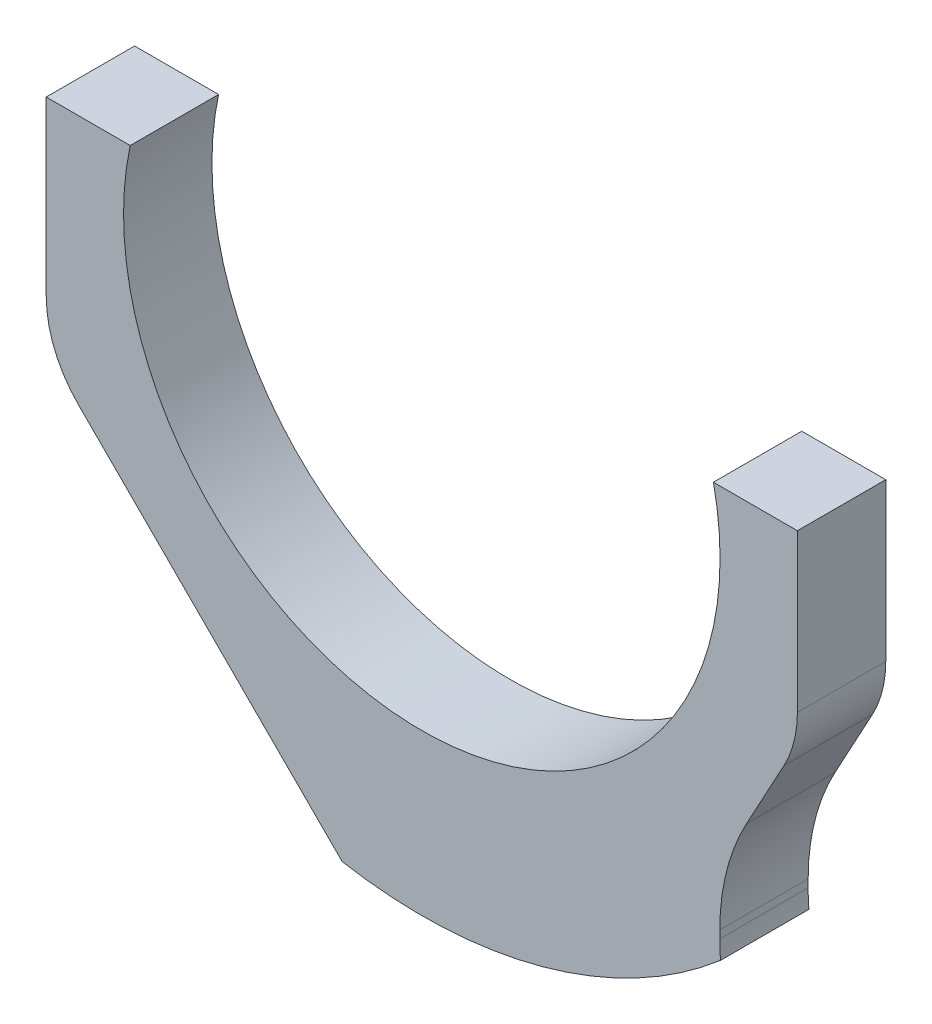
ISO-10303-21;
HEADER;
FILE_DESCRIPTION(('STEP AP214'),'2;1');
FILE_NAME('part.step','',(''),(''),'','','');
FILE_SCHEMA(('AUTOMOTIVE_DESIGN { 1 0 10303 214 1 1 1 1 }'));
ENDSEC;
DATA;
#1=APPLICATION_CONTEXT('core data for automotive mechanical design processes');
#2=APPLICATION_PROTOCOL_DEFINITION('international standard','automotive_design',2000,#1);
#3=PRODUCT_CONTEXT('',#1,'mechanical');
#4=PRODUCT('Part','Part','',(#3));
#5=PRODUCT_RELATED_PRODUCT_CATEGORY('part','',(#4));
#6=PRODUCT_DEFINITION_FORMATION('','',#4);
#7=PRODUCT_DEFINITION_CONTEXT('part definition',#1,'design');
#8=PRODUCT_DEFINITION('design','',#6,#7);
#9=PRODUCT_DEFINITION_SHAPE('','',#8);
#10=(LENGTH_UNIT() NAMED_UNIT(*) SI_UNIT(.MILLI.,.METRE.));
#11=(NAMED_UNIT(*) PLANE_ANGLE_UNIT() SI_UNIT($,.RADIAN.));
#12=(NAMED_UNIT(*) SI_UNIT($,.STERADIAN.) SOLID_ANGLE_UNIT());
#13=UNCERTAINTY_MEASURE_WITH_UNIT(LENGTH_MEASURE(1.E-05),#10,'distance_accuracy_value','');
#14=(GEOMETRIC_REPRESENTATION_CONTEXT(3) GLOBAL_UNCERTAINTY_ASSIGNED_CONTEXT((#13)) GLOBAL_UNIT_ASSIGNED_CONTEXT((#10,
#11,#12)) REPRESENTATION_CONTEXT('',''));
#15=CARTESIAN_POINT('',(0.,0.,0.));
#16=DIRECTION('',(0.,0.,1.));
#17=DIRECTION('',(1.,0.,0.));
#18=AXIS2_PLACEMENT_3D('',#15,#16,#17);
#19=CARTESIAN_POINT('',(-13.7,-13.7,-64.2263444752958));
#20=DIRECTION('',(0.707106781186548,0.707106781186548,0.));
#21=DIRECTION('',(-0.707106781186548,0.707106781186548,0.));
#22=AXIS2_PLACEMENT_3D('',#19,#20,#21);
#23=PLANE('',#22);
#24=DIRECTION('',(0.,0.,-1.));
#25=VECTOR('',#24,1.);
#26=CARTESIAN_POINT('',(-82.5145295534991,55.1145295534991,34.648544483999));
#27=LINE('',#26,#25);
#28=CARTESIAN_POINT('',(-82.5145295534991,55.1145295534991,-11.5));
#29=VERTEX_POINT('',#28);
#30=CARTESIAN_POINT('',(-82.5145295534991,55.1145295534991,-15.5));
#31=VERTEX_POINT('',#30);
#32=EDGE_CURVE('E214',#29,#31,#27,.T.);
#33=ORIENTED_EDGE('',*,*,#32,.F.);
#34=DIRECTION('',(0.707106781186548,-0.707106781186548,0.));
#35=VECTOR('',#34,1.);
#36=CARTESIAN_POINT('',(-13.7,-13.7,-11.5));
#37=LINE('',#36,#35);
#38=CARTESIAN_POINT('',(-94.44850397862,67.04850397862,-11.5));
#39=VERTEX_POINT('',#38);
#40=EDGE_CURVE('E260',#39,#29,#37,.T.);
#41=ORIENTED_EDGE('',*,*,#40,.F.);
#42=DIRECTION('',(0.,0.,1.));
#43=VECTOR('',#42,1.);
#44=CARTESIAN_POINT('',(-94.44850397862,67.04850397862,-64.2263444752958));
#45=LINE('',#44,#43);
#46=CARTESIAN_POINT('',(-94.44850397862,67.04850397862,-15.5));
#47=VERTEX_POINT('',#46);
#48=EDGE_CURVE('E232',#39,#47,#45,.F.);
#49=ORIENTED_EDGE('',*,*,#48,.T.);
#50=DIRECTION('',(0.707106781186548,-0.707106781186548,0.));
#51=VECTOR('',#50,1.);
#52=CARTESIAN_POINT('',(-13.7,-13.7,-15.5));
#53=LINE('',#52,#51);
#54=EDGE_CURVE('E226',#47,#31,#53,.T.);
#55=ORIENTED_EDGE('',*,*,#54,.T.);
#56=EDGE_LOOP('',(#33,#41,#49,#55));
#57=FACE_BOUND('',#56,.T.);
#58=ADVANCED_FACE('F125',(#57),#23,.F.);
#59=CARTESIAN_POINT('',(-55.4259401453745,60.6373033921037,-30.));
#60=DIRECTION('',(0.,0.,1.));
#61=DIRECTION('',(1.,0.,0.));
#62=AXIS2_PLACEMENT_3D('',#59,#60,#61);
#63=CYLINDRICAL_SURFACE('',#62,9.99999999999999);
#64=DIRECTION('',(0.,0.,-1.));
#65=VECTOR('',#64,1.);
#66=CARTESIAN_POINT('',(-65.3915380406063,59.8085340692206,0.));
#67=LINE('',#66,#65);
#68=CARTESIAN_POINT('',(-65.3915380406063,59.8085340692206,-15.5));
#69=VERTEX_POINT('',#68);
#70=CARTESIAN_POINT('',(-65.3915380406063,59.8085340692206,-11.5));
#71=VERTEX_POINT('',#70);
#72=EDGE_CURVE('E12',#69,#71,#67,.F.);
#73=ORIENTED_EDGE('',*,*,#72,.F.);
#74=CARTESIAN_POINT('',(-55.4259401453745,60.6373033921037,-15.5));
#75=DIRECTION('',(0.,0.,1.));
#76=DIRECTION('',(1.,0.,0.));
#77=AXIS2_PLACEMENT_3D('',#74,#75,#76);
#78=CIRCLE('',#77,9.99999999999999);
#79=CARTESIAN_POINT('',(-65.4259401453745,60.6373033921038,-15.5));
#80=VERTEX_POINT('',#79);
#81=EDGE_CURVE('E229',#80,#69,#78,.T.);
#82=ORIENTED_EDGE('',*,*,#81,.F.);
#83=DIRECTION('',(0.,0.,1.));
#84=VECTOR('',#83,1.);
#85=CARTESIAN_POINT('',(-65.4259401453745,60.6373033921038,-30.));
#86=LINE('',#85,#84);
#87=CARTESIAN_POINT('',(-65.4259401453745,60.6373033921038,-11.5));
#88=VERTEX_POINT('',#87);
#89=EDGE_CURVE('E233',#80,#88,#86,.T.);
#90=ORIENTED_EDGE('',*,*,#89,.T.);
#91=CARTESIAN_POINT('',(-55.4259401453745,60.6373033921037,-11.5));
#92=DIRECTION('',(0.,0.,-1.));
#93=DIRECTION('',(-1.,0.,0.));
#94=AXIS2_PLACEMENT_3D('',#91,#92,#93);
#95=CIRCLE('',#94,9.99999999999999);
#96=EDGE_CURVE('E236',#71,#88,#95,.T.);
#97=ORIENTED_EDGE('',*,*,#96,.F.);
#98=EDGE_LOOP('',(#73,#82,#90,#97));
#99=FACE_BOUND('',#98,.T.);
#100=ADVANCED_FACE('F356',(#99),#63,.F.);
#101=CARTESIAN_POINT('',(-72.4,4.,-11.5));
#102=DIRECTION('',(0.,0.,-1.));
#103=DIRECTION('',(-1.,0.,0.));
#104=AXIS2_PLACEMENT_3D('',#101,#102,#103);
#105=PLANE('',#104);
#106=CARTESIAN_POINT('',(-78.9129700726873,75.5546006330299,-11.5));
#107=DIRECTION('',(0.,0.,-1.));
#108=DIRECTION('',(-1.,0.,0.));
#109=AXIS2_PLACEMENT_3D('',#106,#107,#108);
#110=CIRCLE('',#109,20.7549448669491);
#111=EDGE_CURVE('E216',#71,#29,#110,.T.);
#112=ORIENTED_EDGE('',*,*,#111,.F.);
#113=ORIENTED_EDGE('',*,*,#96,.T.);
#114=DIRECTION('',(0.,1.,0.));
#115=VECTOR('',#114,1.);
#116=CARTESIAN_POINT('',(-65.4259401453745,60.9871364074114,-11.5));
#117=LINE('',#116,#115);
#118=CARTESIAN_POINT('',(-65.4259401453745,60.9871364074114,-11.5));
#119=VERTEX_POINT('',#118);
#120=EDGE_CURVE('E257',#88,#119,#117,.T.);
#121=ORIENTED_EDGE('',*,*,#120,.T.);
#122=CARTESIAN_POINT('',(-55.4259401453745,60.9871364074114,-11.5));
#123=DIRECTION('',(0.,0.,1.));
#124=DIRECTION('',(1.,0.,0.));
#125=AXIS2_PLACEMENT_3D('',#122,#123,#124);
#126=CIRCLE('',#125,10.);
#127=CARTESIAN_POINT('',(-64.2155736468005,65.7560296658741,-11.5));
#128=VERTEX_POINT('',#127);
#129=EDGE_CURVE('E280',#119,#128,#126,.F.);
#130=ORIENTED_EDGE('',*,*,#129,.T.);
#131=DIRECTION('',(0.476889325846263,0.878963350142597,0.));
#132=VECTOR('',#131,1.);
#133=CARTESIAN_POINT('',(-61.9129700726873,70.,-11.5));
#134=LINE('',#133,#132);
#135=CARTESIAN_POINT('',(-62.5181533219743,68.8845757969114,-11.5));
#136=VERTEX_POINT('',#135);
#137=EDGE_CURVE('E282',#128,#136,#134,.T.);
#138=ORIENTED_EDGE('',*,*,#137,.T.);
#139=CARTESIAN_POINT('',(-66.9129700726873,71.2690224261428,-11.5));
#140=DIRECTION('',(0.,0.,-1.));
#141=DIRECTION('',(-1.,0.,0.));
#142=AXIS2_PLACEMENT_3D('',#139,#140,#141);
#143=CIRCLE('',#142,5.);
#144=CARTESIAN_POINT('',(-61.9129700726873,71.2690224261428,-11.5));
#145=VERTEX_POINT('',#144);
#146=EDGE_CURVE('E278',#136,#145,#143,.F.);
#147=ORIENTED_EDGE('',*,*,#146,.T.);
#148=DIRECTION('',(0.,1.,0.));
#149=VECTOR('',#148,1.);
#150=CARTESIAN_POINT('',(-61.9129700726873,0.,-11.5));
#151=LINE('',#150,#149);
#152=CARTESIAN_POINT('',(-61.9129700726873,78.3905278913526,-11.5));
#153=VERTEX_POINT('',#152);
#154=EDGE_CURVE('E276',#145,#153,#151,.T.);
#155=ORIENTED_EDGE('',*,*,#154,.T.);
#156=DIRECTION('',(-1.,0.,0.));
#157=VECTOR('',#156,1.);
#158=CARTESIAN_POINT('',(0.,78.3905278913526,-11.5));
#159=LINE('',#158,#157);
#160=CARTESIAN_POINT('',(-65.7142005624071,78.3905278913526,-11.5));
#161=VERTEX_POINT('',#160);
#162=EDGE_CURVE('E269',#153,#161,#159,.T.);
#163=ORIENTED_EDGE('',*,*,#162,.T.);
#164=CARTESIAN_POINT('',(-78.9129700726873,75.5546006330299,-11.5));
#165=DIRECTION('',(0.,0.,1.));
#166=DIRECTION('',(1.,0.,0.));
#167=AXIS2_PLACEMENT_3D('',#164,#165,#166);
#168=CIRCLE('',#167,13.5);
#169=CARTESIAN_POINT('',(-92.1117395829675,78.3905278913526,-11.5));
#170=VERTEX_POINT('',#169);
#171=EDGE_CURVE('E270',#170,#161,#168,.T.);
#172=ORIENTED_EDGE('',*,*,#171,.F.);
#173=DIRECTION('',(-1.,0.,0.));
#174=VECTOR('',#173,1.);
#175=CARTESIAN_POINT('',(0.,78.3905278913526,-11.5));
#176=LINE('',#175,#174);
#177=CARTESIAN_POINT('',(-95.9129700726873,78.3905278913526,-11.5));
#178=VERTEX_POINT('',#177);
#179=EDGE_CURVE('E267',#170,#178,#176,.T.);
#180=ORIENTED_EDGE('',*,*,#179,.T.);
#181=DIRECTION('',(0.,-1.,0.));
#182=VECTOR('',#181,1.);
#183=CARTESIAN_POINT('',(-95.9129700726873,0.,-11.5));
#184=LINE('',#183,#182);
#185=CARTESIAN_POINT('',(-95.9129700726873,70.5840378845528,-11.5));
#186=VERTEX_POINT('',#185);
#187=EDGE_CURVE('E264',#178,#186,#184,.T.);
#188=ORIENTED_EDGE('',*,*,#187,.T.);
#189=CARTESIAN_POINT('',(-90.9129700726873,70.5840378845528,-11.5));
#190=DIRECTION('',(0.,0.,-1.));
#191=DIRECTION('',(-1.,0.,0.));
#192=AXIS2_PLACEMENT_3D('',#189,#190,#191);
#193=CIRCLE('',#192,5.);
#194=EDGE_CURVE('E263',#186,#39,#193,.F.);
#195=ORIENTED_EDGE('',*,*,#194,.T.);
#196=ORIENTED_EDGE('',*,*,#40,.T.);
#197=EDGE_LOOP('',(#112,#113,#121,#130,#138,#147,#155,#163,#172,#180,#188,#195,#196));
#198=FACE_BOUND('',#197,.T.);
#199=ADVANCED_FACE('F334',(#198),#105,.F.);
#200=CARTESIAN_POINT('',(-72.4,4.,-15.5));
#201=DIRECTION('',(0.,0.,1.));
#202=DIRECTION('',(1.,0.,0.));
#203=AXIS2_PLACEMENT_3D('',#200,#201,#202);
#204=PLANE('',#203);
#205=CARTESIAN_POINT('',(-78.9129700726873,75.5546006330299,-15.5));
#206=DIRECTION('',(0.,0.,1.));
#207=DIRECTION('',(1.,0.,0.));
#208=AXIS2_PLACEMENT_3D('',#205,#206,#207);
#209=CIRCLE('',#208,20.7549448669491);
#210=EDGE_CURVE('E135',#31,#69,#209,.T.);
#211=ORIENTED_EDGE('',*,*,#210,.F.);
#212=ORIENTED_EDGE('',*,*,#54,.F.);
#213=CARTESIAN_POINT('',(-90.9129700726873,70.5840378845528,-15.5));
#214=DIRECTION('',(0.,0.,1.));
#215=DIRECTION('',(1.,0.,0.));
#216=AXIS2_PLACEMENT_3D('',#213,#214,#215);
#217=CIRCLE('',#216,5.);
#218=CARTESIAN_POINT('',(-95.9129700726873,70.5840378845528,-15.5));
#219=VERTEX_POINT('',#218);
#220=EDGE_CURVE('E262',#47,#219,#217,.F.);
#221=ORIENTED_EDGE('',*,*,#220,.T.);
#222=DIRECTION('',(0.,-1.,0.));
#223=VECTOR('',#222,1.);
#224=CARTESIAN_POINT('',(-95.9129700726873,0.,-15.5));
#225=LINE('',#224,#223);
#226=CARTESIAN_POINT('',(-95.9129700726873,78.3905278913526,-15.5));
#227=VERTEX_POINT('',#226);
#228=EDGE_CURVE('E243',#227,#219,#225,.T.);
#229=ORIENTED_EDGE('',*,*,#228,.F.);
#230=DIRECTION('',(-1.,0.,0.));
#231=VECTOR('',#230,1.);
#232=CARTESIAN_POINT('',(0.,78.3905278913526,-15.5));
#233=LINE('',#232,#231);
#234=CARTESIAN_POINT('',(-92.1117395829675,78.3905278913526,-15.5));
#235=VERTEX_POINT('',#234);
#236=EDGE_CURVE('E272',#235,#227,#233,.T.);
#237=ORIENTED_EDGE('',*,*,#236,.F.);
#238=CARTESIAN_POINT('',(-78.9129700726873,75.5546006330299,-15.5));
#239=DIRECTION('',(0.,0.,1.));
#240=DIRECTION('',(1.,0.,0.));
#241=AXIS2_PLACEMENT_3D('',#238,#239,#240);
#242=CIRCLE('',#241,13.5);
#243=CARTESIAN_POINT('',(-65.7142005624071,78.3905278913526,-15.5));
#244=VERTEX_POINT('',#243);
#245=EDGE_CURVE('E315',#235,#244,#242,.T.);
#246=ORIENTED_EDGE('',*,*,#245,.T.);
#247=DIRECTION('',(-1.,0.,0.));
#248=VECTOR('',#247,1.);
#249=CARTESIAN_POINT('',(0.,78.3905278913526,-15.5));
#250=LINE('',#249,#248);
#251=CARTESIAN_POINT('',(-61.9129700726873,78.3905278913526,-15.5));
#252=VERTEX_POINT('',#251);
#253=EDGE_CURVE('E289',#252,#244,#250,.T.);
#254=ORIENTED_EDGE('',*,*,#253,.F.);
#255=DIRECTION('',(0.,1.,0.));
#256=VECTOR('',#255,1.);
#257=CARTESIAN_POINT('',(-61.9129700726873,0.,-15.5));
#258=LINE('',#257,#256);
#259=CARTESIAN_POINT('',(-61.9129700726873,71.2690224261428,-15.5));
#260=VERTEX_POINT('',#259);
#261=EDGE_CURVE('E241',#260,#252,#258,.T.);
#262=ORIENTED_EDGE('',*,*,#261,.F.);
#263=CARTESIAN_POINT('',(-66.9129700726873,71.2690224261428,-15.5));
#264=DIRECTION('',(0.,0.,1.));
#265=DIRECTION('',(1.,0.,0.));
#266=AXIS2_PLACEMENT_3D('',#263,#264,#265);
#267=CIRCLE('',#266,5.);
#268=CARTESIAN_POINT('',(-62.5181533219743,68.8845757969114,-15.5));
#269=VERTEX_POINT('',#268);
#270=EDGE_CURVE('E259',#260,#269,#267,.F.);
#271=ORIENTED_EDGE('',*,*,#270,.T.);
#272=DIRECTION('',(-0.476889325846263,-0.878963350142597,0.));
#273=VECTOR('',#272,1.);
#274=CARTESIAN_POINT('',(-91.9630701864381,14.6141164488599,-15.5));
#275=LINE('',#274,#273);
#276=CARTESIAN_POINT('',(-64.2155736468005,65.7560296658741,-15.5));
#277=VERTEX_POINT('',#276);
#278=EDGE_CURVE('E253',#269,#277,#275,.T.);
#279=ORIENTED_EDGE('',*,*,#278,.T.);
#280=CARTESIAN_POINT('',(-55.4259401453745,60.9871364074114,-15.5));
#281=DIRECTION('',(0.,0.,1.));
#282=DIRECTION('',(1.,0.,0.));
#283=AXIS2_PLACEMENT_3D('',#280,#281,#282);
#284=CIRCLE('',#283,10.);
#285=CARTESIAN_POINT('',(-65.4259401453745,60.9871364074114,-15.5));
#286=VERTEX_POINT('',#285);
#287=EDGE_CURVE('E250',#277,#286,#284,.T.);
#288=ORIENTED_EDGE('',*,*,#287,.T.);
#289=DIRECTION('',(0.,-1.,0.));
#290=VECTOR('',#289,1.);
#291=CARTESIAN_POINT('',(-65.4259401453745,4.,-15.5));
#292=LINE('',#291,#290);
#293=EDGE_CURVE('E248',#286,#80,#292,.T.);
#294=ORIENTED_EDGE('',*,*,#293,.T.);
#295=ORIENTED_EDGE('',*,*,#81,.T.);
#296=EDGE_LOOP('',(#211,#212,#221,#229,#237,#246,#254,#262,#271,#279,#288,#294,#295));
#297=FACE_BOUND('',#296,.T.);
#298=ADVANCED_FACE('F225',(#297),#204,.F.);
#299=CARTESIAN_POINT('',(-61.9129700726873,0.,-64.2263444752958));
#300=DIRECTION('',(-1.,0.,0.));
#301=DIRECTION('',(0.,0.,1.));
#302=AXIS2_PLACEMENT_3D('',#299,#300,#301);
#303=PLANE('',#302);
#304=ORIENTED_EDGE('',*,*,#154,.F.);
#305=DIRECTION('',(0.,0.,-1.));
#306=VECTOR('',#305,1.);
#307=CARTESIAN_POINT('',(-61.9129700726873,71.2690224261428,-64.2263444752958));
#308=LINE('',#307,#306);
#309=EDGE_CURVE('E255',#145,#260,#308,.T.);
#310=ORIENTED_EDGE('',*,*,#309,.T.);
#311=ORIENTED_EDGE('',*,*,#261,.T.);
#312=DIRECTION('',(0.,0.,1.));
#313=VECTOR('',#312,1.);
#314=CARTESIAN_POINT('',(-61.9129700726873,78.3905278913526,-64.2263444752958));
#315=LINE('',#314,#313);
#316=EDGE_CURVE('E290',#252,#153,#315,.T.);
#317=ORIENTED_EDGE('',*,*,#316,.T.);
#318=EDGE_LOOP('',(#304,#310,#311,#317));
#319=FACE_BOUND('',#318,.T.);
#320=ADVANCED_FACE('F339',(#319),#303,.F.);
#321=CARTESIAN_POINT('',(-78.9129700726873,75.5546006330299,-64.2263444752958));
#322=DIRECTION('',(0.,0.,1.));
#323=DIRECTION('',(1.,0.,0.));
#324=AXIS2_PLACEMENT_3D('',#321,#322,#323);
#325=CYLINDRICAL_SURFACE('',#324,13.5);
#326=DIRECTION('',(0.,0.,1.));
#327=VECTOR('',#326,1.);
#328=CARTESIAN_POINT('',(-92.1117395829675,78.3905278913526,-64.2263444752958));
#329=LINE('',#328,#327);
#330=EDGE_CURVE('E273',#235,#170,#329,.T.);
#331=ORIENTED_EDGE('',*,*,#330,.T.);
#332=ORIENTED_EDGE('',*,*,#171,.T.);
#333=DIRECTION('',(0.,0.,1.));
#334=VECTOR('',#333,1.);
#335=CARTESIAN_POINT('',(-65.7142005624071,78.3905278913526,-64.2263444752958));
#336=LINE('',#335,#334);
#337=EDGE_CURVE('E285',#244,#161,#336,.T.);
#338=ORIENTED_EDGE('',*,*,#337,.F.);
#339=ORIENTED_EDGE('',*,*,#245,.F.);
#340=EDGE_LOOP('',(#331,#332,#338,#339));
#341=FACE_BOUND('',#340,.T.);
#342=ADVANCED_FACE('F381',(#341),#325,.F.);
#343=CARTESIAN_POINT('',(0.,78.3905278913526,-64.2263444752958));
#344=DIRECTION('',(0.,-1.,0.));
#345=DIRECTION('',(0.,0.,-1.));
#346=AXIS2_PLACEMENT_3D('',#343,#344,#345);
#347=PLANE('',#346);
#348=ORIENTED_EDGE('',*,*,#179,.F.);
#349=ORIENTED_EDGE('',*,*,#330,.F.);
#350=ORIENTED_EDGE('',*,*,#236,.T.);
#351=DIRECTION('',(0.,0.,1.));
#352=VECTOR('',#351,1.);
#353=CARTESIAN_POINT('',(-95.9129700726873,78.3905278913526,-64.2263444752958));
#354=LINE('',#353,#352);
#355=EDGE_CURVE('E247',#227,#178,#354,.T.);
#356=ORIENTED_EDGE('',*,*,#355,.T.);
#357=EDGE_LOOP('',(#348,#349,#350,#356));
#358=FACE_BOUND('',#357,.T.);
#359=ADVANCED_FACE('F377',(#358),#347,.F.);
#360=CARTESIAN_POINT('',(-95.9129700726873,0.,-64.2263444752958));
#361=DIRECTION('',(1.,0.,0.));
#362=DIRECTION('',(0.,0.,-1.));
#363=AXIS2_PLACEMENT_3D('',#360,#361,#362);
#364=PLANE('',#363);
#365=ORIENTED_EDGE('',*,*,#228,.T.);
#366=DIRECTION('',(0.,0.,1.));
#367=VECTOR('',#366,1.);
#368=CARTESIAN_POINT('',(-95.9129700726873,70.5840378845528,-64.2263444752958));
#369=LINE('',#368,#367);
#370=EDGE_CURVE('E246',#219,#186,#369,.T.);
#371=ORIENTED_EDGE('',*,*,#370,.T.);
#372=ORIENTED_EDGE('',*,*,#187,.F.);
#373=ORIENTED_EDGE('',*,*,#355,.F.);
#374=EDGE_LOOP('',(#365,#371,#372,#373));
#375=FACE_BOUND('',#374,.T.);
#376=ADVANCED_FACE('F368',(#375),#364,.F.);
#377=CARTESIAN_POINT('',(0.,78.3905278913526,-64.2263444752958));
#378=DIRECTION('',(0.,-1.,0.));
#379=DIRECTION('',(0.,0.,-1.));
#380=AXIS2_PLACEMENT_3D('',#377,#378,#379);
#381=PLANE('',#380);
#382=ORIENTED_EDGE('',*,*,#162,.F.);
#383=ORIENTED_EDGE('',*,*,#316,.F.);
#384=ORIENTED_EDGE('',*,*,#253,.T.);
#385=ORIENTED_EDGE('',*,*,#337,.T.);
#386=EDGE_LOOP('',(#382,#383,#384,#385));
#387=FACE_BOUND('',#386,.T.);
#388=ADVANCED_FACE('F364',(#387),#381,.F.);
#389=CARTESIAN_POINT('',(-65.4259401453745,60.9871364074114,-30.));
#390=DIRECTION('',(-1.,0.,0.));
#391=DIRECTION('',(0.,0.,1.));
#392=AXIS2_PLACEMENT_3D('',#389,#390,#391);
#393=PLANE('',#392);
#394=ORIENTED_EDGE('',*,*,#120,.F.);
#395=ORIENTED_EDGE('',*,*,#89,.F.);
#396=ORIENTED_EDGE('',*,*,#293,.F.);
#397=DIRECTION('',(0.,0.,1.));
#398=VECTOR('',#397,1.);
#399=CARTESIAN_POINT('',(-65.4259401453745,60.9871364074114,-30.));
#400=LINE('',#399,#398);
#401=EDGE_CURVE('E288',#286,#119,#400,.T.);
#402=ORIENTED_EDGE('',*,*,#401,.T.);
#403=EDGE_LOOP('',(#394,#395,#396,#402));
#404=FACE_BOUND('',#403,.T.);
#405=ADVANCED_FACE('F352',(#404),#393,.F.);
#406=CARTESIAN_POINT('',(-55.4259401453745,60.9871364074114,-30.));
#407=DIRECTION('',(0.,0.,1.));
#408=DIRECTION('',(1.,0.,0.));
#409=AXIS2_PLACEMENT_3D('',#406,#407,#408);
#410=CYLINDRICAL_SURFACE('',#409,10.);
#411=ORIENTED_EDGE('',*,*,#129,.F.);
#412=ORIENTED_EDGE('',*,*,#401,.F.);
#413=ORIENTED_EDGE('',*,*,#287,.F.);
#414=DIRECTION('',(0.,0.,1.));
#415=VECTOR('',#414,1.);
#416=CARTESIAN_POINT('',(-64.2155736468005,65.7560296658741,-30.));
#417=LINE('',#416,#415);
#418=EDGE_CURVE('E129',#277,#128,#417,.T.);
#419=ORIENTED_EDGE('',*,*,#418,.T.);
#420=EDGE_LOOP('',(#411,#412,#413,#419));
#421=FACE_BOUND('',#420,.T.);
#422=ADVANCED_FACE('F344',(#421),#410,.F.);
#423=CARTESIAN_POINT('',(-61.9129700726873,70.,-30.));
#424=DIRECTION('',(-0.878963350142597,0.476889325846263,0.));
#425=DIRECTION('',(-0.476889325846263,-0.878963350142597,0.));
#426=AXIS2_PLACEMENT_3D('',#423,#424,#425);
#427=PLANE('',#426);
#428=ORIENTED_EDGE('',*,*,#278,.F.);
#429=DIRECTION('',(0.,0.,-1.));
#430=VECTOR('',#429,1.);
#431=CARTESIAN_POINT('',(-62.5181533219743,68.8845757969114,-30.));
#432=LINE('',#431,#430);
#433=EDGE_CURVE('E283',#269,#136,#432,.F.);
#434=ORIENTED_EDGE('',*,*,#433,.T.);
#435=ORIENTED_EDGE('',*,*,#137,.F.);
#436=ORIENTED_EDGE('',*,*,#418,.F.);
#437=EDGE_LOOP('',(#428,#434,#435,#436));
#438=FACE_BOUND('',#437,.T.);
#439=ADVANCED_FACE('F342',(#438),#427,.F.);
#440=CARTESIAN_POINT('',(-66.9129700726873,71.2690224261428,-64.2263444752958));
#441=DIRECTION('',(0.,0.,-1.));
#442=DIRECTION('',(-1.,0.,0.));
#443=AXIS2_PLACEMENT_3D('',#440,#441,#442);
#444=CYLINDRICAL_SURFACE('',#443,5.);
#445=ORIENTED_EDGE('',*,*,#146,.F.);
#446=ORIENTED_EDGE('',*,*,#433,.F.);
#447=ORIENTED_EDGE('',*,*,#270,.F.);
#448=ORIENTED_EDGE('',*,*,#309,.F.);
#449=EDGE_LOOP('',(#445,#446,#447,#448));
#450=FACE_BOUND('',#449,.T.);
#451=ADVANCED_FACE('F341',(#450),#444,.T.);
#452=CARTESIAN_POINT('',(-90.9129700726873,70.5840378845528,-64.2263444752958));
#453=DIRECTION('',(0.,0.,1.));
#454=DIRECTION('',(1.,0.,0.));
#455=AXIS2_PLACEMENT_3D('',#452,#453,#454);
#456=CYLINDRICAL_SURFACE('',#455,5.);
#457=ORIENTED_EDGE('',*,*,#220,.F.);
#458=ORIENTED_EDGE('',*,*,#48,.F.);
#459=ORIENTED_EDGE('',*,*,#194,.F.);
#460=ORIENTED_EDGE('',*,*,#370,.F.);
#461=EDGE_LOOP('',(#457,#458,#459,#460));
#462=FACE_BOUND('',#461,.T.);
#463=ADVANCED_FACE('F350',(#462),#456,.T.);
#464=CARTESIAN_POINT('',(-78.9129700726873,75.5546006330299,34.648544483999));
#465=DIRECTION('',(0.,0.,-1.));
#466=DIRECTION('',(-1.,0.,0.));
#467=AXIS2_PLACEMENT_3D('',#464,#465,#466);
#468=CYLINDRICAL_SURFACE('',#467,20.7549448669491);
#469=ORIENTED_EDGE('',*,*,#111,.T.);
#470=ORIENTED_EDGE('',*,*,#32,.T.);
#471=ORIENTED_EDGE('',*,*,#210,.T.);
#472=ORIENTED_EDGE('',*,*,#72,.T.);
#473=EDGE_LOOP('',(#469,#470,#471,#472));
#474=FACE_BOUND('',#473,.T.);
#475=ADVANCED_FACE('F127',(#474),#468,.T.);
#476=CLOSED_SHELL('',(#58,#100,#199,#298,#320,#342,#359,#376,#388,#405,#422,#439,#451,#463,#475));
#477=MANIFOLD_SOLID_BREP('B2',#476);
#478=ADVANCED_BREP_SHAPE_REPRESENTATION('',(#18,#477),#14);
#479=SHAPE_DEFINITION_REPRESENTATION(#9,#478);
ENDSEC;
END-ISO-10303-21;
